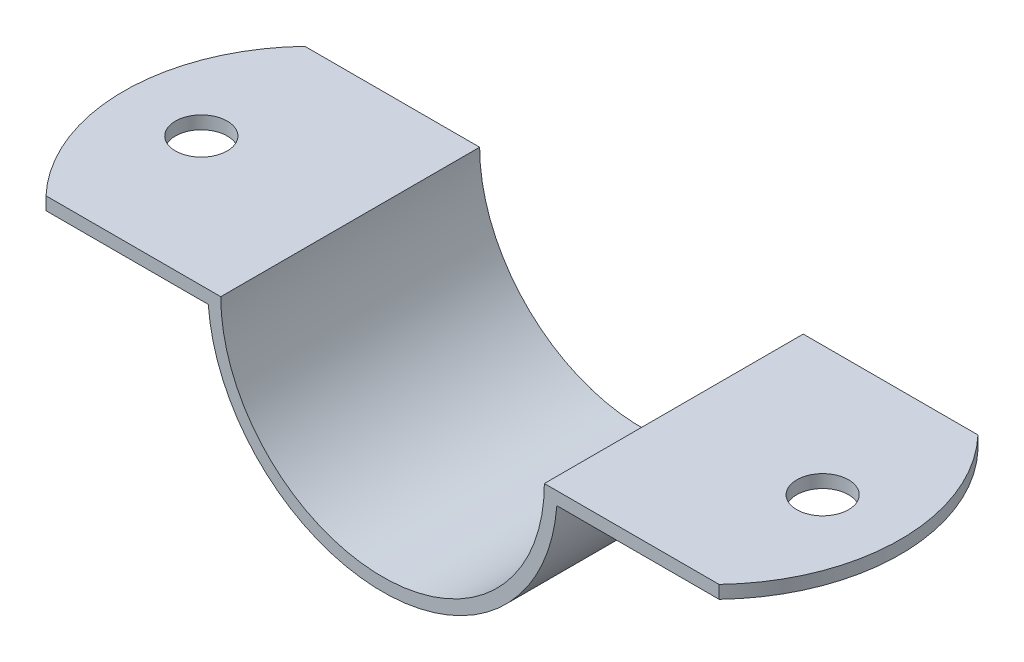
ISO-10303-21;
HEADER;
FILE_DESCRIPTION(('STEP AP214'),'2;1');
FILE_NAME('part.step','',(''),(''),'','','');
FILE_SCHEMA(('AUTOMOTIVE_DESIGN { 1 0 10303 214 1 1 1 1 }'));
ENDSEC;
DATA;
#1=APPLICATION_CONTEXT('core data for automotive mechanical design processes');
#2=APPLICATION_PROTOCOL_DEFINITION('international standard','automotive_design',2000,#1);
#3=PRODUCT_CONTEXT('',#1,'mechanical');
#4=PRODUCT('Part','Part','',(#3));
#5=PRODUCT_RELATED_PRODUCT_CATEGORY('part','',(#4));
#6=PRODUCT_DEFINITION_FORMATION('','',#4);
#7=PRODUCT_DEFINITION_CONTEXT('part definition',#1,'design');
#8=PRODUCT_DEFINITION('design','',#6,#7);
#9=PRODUCT_DEFINITION_SHAPE('','',#8);
#10=(LENGTH_UNIT() NAMED_UNIT(*) SI_UNIT(.MILLI.,.METRE.));
#11=(NAMED_UNIT(*) PLANE_ANGLE_UNIT() SI_UNIT($,.RADIAN.));
#12=(NAMED_UNIT(*) SI_UNIT($,.STERADIAN.) SOLID_ANGLE_UNIT());
#13=UNCERTAINTY_MEASURE_WITH_UNIT(LENGTH_MEASURE(1.E-05),#10,'distance_accuracy_value','');
#14=(GEOMETRIC_REPRESENTATION_CONTEXT(3) GLOBAL_UNCERTAINTY_ASSIGNED_CONTEXT((#13)) GLOBAL_UNIT_ASSIGNED_CONTEXT((#10,
#11,#12)) REPRESENTATION_CONTEXT('',''));
#15=CARTESIAN_POINT('',(0.,0.,0.));
#16=DIRECTION('',(0.,0.,1.));
#17=DIRECTION('',(1.,0.,0.));
#18=AXIS2_PLACEMENT_3D('',#15,#16,#17);
#19=CARTESIAN_POINT('',(-12.5,0.,20.));
#20=DIRECTION('',(0.,-1.,0.));
#21=DIRECTION('',(1.,0.,0.));
#22=AXIS2_PLACEMENT_3D('',#19,#20,#21);
#23=PLANE('',#22);
#24=CARTESIAN_POINT('',(-15.5,0.,10.));
#25=DIRECTION('',(0.,1.,0.));
#26=DIRECTION('',(0.,0.,1.));
#27=AXIS2_PLACEMENT_3D('',#24,#25,#26);
#28=CIRCLE('',#27,14.5);
#29=CARTESIAN_POINT('',(-26.,0.,20.));
#30=VERTEX_POINT('',#29);
#31=CARTESIAN_POINT('',(-26.,0.,0.));
#32=VERTEX_POINT('',#31);
#33=EDGE_CURVE('E73',#30,#32,#28,.F.);
#34=ORIENTED_EDGE('',*,*,#33,.F.);
#35=DIRECTION('',(-1.,0.,0.));
#36=VECTOR('',#35,1.);
#37=CARTESIAN_POINT('',(-12.5,0.,20.));
#38=LINE('',#37,#36);
#39=CARTESIAN_POINT('',(-12.5,0.,20.));
#40=VERTEX_POINT('',#39);
#41=EDGE_CURVE('E125',#40,#30,#38,.T.);
#42=ORIENTED_EDGE('',*,*,#41,.F.);
#43=DIRECTION('',(0.,0.,-1.));
#44=VECTOR('',#43,1.);
#45=CARTESIAN_POINT('',(-12.5,0.,20.));
#46=LINE('',#45,#44);
#47=CARTESIAN_POINT('',(-12.5,0.,0.));
#48=VERTEX_POINT('',#47);
#49=EDGE_CURVE('E175',#40,#48,#46,.T.);
#50=ORIENTED_EDGE('',*,*,#49,.T.);
#51=DIRECTION('',(-1.,0.,0.));
#52=VECTOR('',#51,1.);
#53=CARTESIAN_POINT('',(-12.5,0.,0.));
#54=LINE('',#53,#52);
#55=EDGE_CURVE('E127',#48,#32,#54,.T.);
#56=ORIENTED_EDGE('',*,*,#55,.T.);
#57=EDGE_LOOP('',(#34,#42,#50,#56));
#58=FACE_BOUND('',#57,.T.);
#59=CARTESIAN_POINT('',(-24.,0.,10.));
#60=DIRECTION('',(0.,-1.,0.));
#61=DIRECTION('',(1.,0.,0.));
#62=AXIS2_PLACEMENT_3D('',#59,#60,#61);
#63=CIRCLE('',#62,2.00000000000001);
#64=CARTESIAN_POINT('',(-22.,0.,10.));
#65=VERTEX_POINT('',#64);
#66=EDGE_CURVE('E129',#65,#65,#63,.T.);
#67=ORIENTED_EDGE('',*,*,#66,.T.);
#68=EDGE_LOOP('',(#67));
#69=FACE_BOUND('',#68,.T.);
#70=ADVANCED_FACE('F58',(#58,#69),#23,.F.);
#71=CARTESIAN_POINT('',(-30.,-1.,20.));
#72=DIRECTION('',(0.,1.,0.));
#73=DIRECTION('',(-1.,0.,0.));
#74=AXIS2_PLACEMENT_3D('',#71,#72,#73);
#75=PLANE('',#74);
#76=DIRECTION('',(1.,0.,0.));
#77=VECTOR('',#76,1.);
#78=CARTESIAN_POINT('',(-30.,-1.,20.));
#79=LINE('',#78,#77);
#80=CARTESIAN_POINT('',(-26.,-1.,20.));
#81=VERTEX_POINT('',#80);
#82=CARTESIAN_POINT('',(-13.4629120178363,-0.999999999999997,20.));
#83=VERTEX_POINT('',#82);
#84=EDGE_CURVE('E139',#81,#83,#79,.T.);
#85=ORIENTED_EDGE('',*,*,#84,.F.);
#86=CARTESIAN_POINT('',(-15.5,-1.,10.));
#87=DIRECTION('',(0.,1.,0.));
#88=DIRECTION('',(-1.,0.,0.));
#89=AXIS2_PLACEMENT_3D('',#86,#87,#88);
#90=CIRCLE('',#89,14.5);
#91=CARTESIAN_POINT('',(-26.,-1.,0.));
#92=VERTEX_POINT('',#91);
#93=EDGE_CURVE('E128',#81,#92,#90,.F.);
#94=ORIENTED_EDGE('',*,*,#93,.T.);
#95=DIRECTION('',(1.,0.,0.));
#96=VECTOR('',#95,1.);
#97=CARTESIAN_POINT('',(-30.,-1.,0.));
#98=LINE('',#97,#96);
#99=CARTESIAN_POINT('',(-13.4629120178363,-0.999999999999997,0.));
#100=VERTEX_POINT('',#99);
#101=EDGE_CURVE('E159',#92,#100,#98,.T.);
#102=ORIENTED_EDGE('',*,*,#101,.T.);
#103=DIRECTION('',(0.,0.,-1.));
#104=VECTOR('',#103,1.);
#105=CARTESIAN_POINT('',(-13.4629120178363,-0.999999999999997,20.));
#106=LINE('',#105,#104);
#107=EDGE_CURVE('E172',#83,#100,#106,.T.);
#108=ORIENTED_EDGE('',*,*,#107,.F.);
#109=EDGE_LOOP('',(#85,#94,#102,#108));
#110=FACE_BOUND('',#109,.T.);
#111=CARTESIAN_POINT('',(-24.,-1.,10.));
#112=DIRECTION('',(0.,1.,0.));
#113=DIRECTION('',(-1.,0.,0.));
#114=AXIS2_PLACEMENT_3D('',#111,#112,#113);
#115=CIRCLE('',#114,2.00000000000001);
#116=CARTESIAN_POINT('',(-26.,-1.,10.));
#117=VERTEX_POINT('',#116);
#118=EDGE_CURVE('E211',#117,#117,#115,.T.);
#119=ORIENTED_EDGE('',*,*,#118,.T.);
#120=EDGE_LOOP('',(#119));
#121=FACE_BOUND('',#120,.T.);
#122=ADVANCED_FACE('F183',(#110,#121),#75,.F.);
#123=CARTESIAN_POINT('',(30.,-1.,20.));
#124=DIRECTION('',(0.,1.,0.));
#125=DIRECTION('',(0.,0.,1.));
#126=AXIS2_PLACEMENT_3D('',#123,#124,#125);
#127=PLANE('',#126);
#128=CARTESIAN_POINT('',(24.,-1.,10.));
#129=DIRECTION('',(0.,-1.,0.));
#130=DIRECTION('',(0.,0.,-1.));
#131=AXIS2_PLACEMENT_3D('',#128,#129,#130);
#132=CIRCLE('',#131,2.);
#133=CARTESIAN_POINT('',(24.,-1.,8.));
#134=VERTEX_POINT('',#133);
#135=EDGE_CURVE('E215',#134,#134,#132,.T.);
#136=ORIENTED_EDGE('',*,*,#135,.F.);
#137=EDGE_LOOP('',(#136));
#138=FACE_BOUND('',#137,.T.);
#139=DIRECTION('',(1.,0.,0.));
#140=VECTOR('',#139,1.);
#141=CARTESIAN_POINT('',(30.,-1.,0.));
#142=LINE('',#141,#140);
#143=CARTESIAN_POINT('',(13.4629120178363,-1.,0.));
#144=VERTEX_POINT('',#143);
#145=CARTESIAN_POINT('',(26.,-1.,0.));
#146=VERTEX_POINT('',#145);
#147=EDGE_CURVE('E163',#144,#146,#142,.T.);
#148=ORIENTED_EDGE('',*,*,#147,.T.);
#149=CARTESIAN_POINT('',(15.5,-1.,10.));
#150=DIRECTION('',(0.,1.,0.));
#151=DIRECTION('',(0.,0.,1.));
#152=AXIS2_PLACEMENT_3D('',#149,#150,#151);
#153=CIRCLE('',#152,14.5);
#154=CARTESIAN_POINT('',(26.,-1.,20.));
#155=VERTEX_POINT('',#154);
#156=EDGE_CURVE('E157',#146,#155,#153,.F.);
#157=ORIENTED_EDGE('',*,*,#156,.T.);
#158=DIRECTION('',(1.,0.,0.));
#159=VECTOR('',#158,1.);
#160=CARTESIAN_POINT('',(30.,-1.,20.));
#161=LINE('',#160,#159);
#162=CARTESIAN_POINT('',(13.4629120178363,-1.,20.));
#163=VERTEX_POINT('',#162);
#164=EDGE_CURVE('E148',#163,#155,#161,.T.);
#165=ORIENTED_EDGE('',*,*,#164,.F.);
#166=DIRECTION('',(0.,0.,-1.));
#167=VECTOR('',#166,1.);
#168=CARTESIAN_POINT('',(13.4629120178363,-1.,20.));
#169=LINE('',#168,#167);
#170=EDGE_CURVE('E169',#163,#144,#169,.T.);
#171=ORIENTED_EDGE('',*,*,#170,.T.);
#172=EDGE_LOOP('',(#148,#157,#165,#171));
#173=FACE_BOUND('',#172,.T.);
#174=ADVANCED_FACE('F197',(#138,#173),#127,.F.);
#175=CARTESIAN_POINT('',(12.5,0.,20.));
#176=DIRECTION('',(0.,-1.,0.));
#177=DIRECTION('',(1.,0.,0.));
#178=AXIS2_PLACEMENT_3D('',#175,#176,#177);
#179=PLANE('',#178);
#180=CARTESIAN_POINT('',(24.,0.,10.));
#181=DIRECTION('',(0.,-1.,0.));
#182=DIRECTION('',(0.,0.,-1.));
#183=AXIS2_PLACEMENT_3D('',#180,#181,#182);
#184=CIRCLE('',#183,2.);
#185=CARTESIAN_POINT('',(24.,0.,8.));
#186=VERTEX_POINT('',#185);
#187=EDGE_CURVE('E214',#186,#186,#184,.T.);
#188=ORIENTED_EDGE('',*,*,#187,.T.);
#189=EDGE_LOOP('',(#188));
#190=FACE_BOUND('',#189,.T.);
#191=CARTESIAN_POINT('',(15.5,0.,10.));
#192=DIRECTION('',(0.,1.,0.));
#193=DIRECTION('',(0.,0.,1.));
#194=AXIS2_PLACEMENT_3D('',#191,#192,#193);
#195=CIRCLE('',#194,14.5);
#196=CARTESIAN_POINT('',(26.,0.,0.));
#197=VERTEX_POINT('',#196);
#198=CARTESIAN_POINT('',(26.,0.,20.));
#199=VERTEX_POINT('',#198);
#200=EDGE_CURVE('E81',#197,#199,#195,.F.);
#201=ORIENTED_EDGE('',*,*,#200,.F.);
#202=DIRECTION('',(-1.,0.,0.));
#203=VECTOR('',#202,1.);
#204=CARTESIAN_POINT('',(12.5,0.,0.));
#205=LINE('',#204,#203);
#206=CARTESIAN_POINT('',(12.5,0.,0.));
#207=VERTEX_POINT('',#206);
#208=EDGE_CURVE('E143',#197,#207,#205,.T.);
#209=ORIENTED_EDGE('',*,*,#208,.T.);
#210=DIRECTION('',(0.,0.,-1.));
#211=VECTOR('',#210,1.);
#212=CARTESIAN_POINT('',(12.5,0.,20.));
#213=LINE('',#212,#211);
#214=CARTESIAN_POINT('',(12.5,0.,20.));
#215=VERTEX_POINT('',#214);
#216=EDGE_CURVE('E153',#215,#207,#213,.T.);
#217=ORIENTED_EDGE('',*,*,#216,.F.);
#218=DIRECTION('',(-1.,0.,0.));
#219=VECTOR('',#218,1.);
#220=CARTESIAN_POINT('',(12.5,0.,20.));
#221=LINE('',#220,#219);
#222=EDGE_CURVE('E151',#199,#215,#221,.T.);
#223=ORIENTED_EDGE('',*,*,#222,.F.);
#224=EDGE_LOOP('',(#201,#209,#217,#223));
#225=FACE_BOUND('',#224,.T.);
#226=ADVANCED_FACE('F202',(#190,#225),#179,.F.);
#227=CARTESIAN_POINT('',(0.,0.,20.));
#228=DIRECTION('',(0.,0.,-1.));
#229=DIRECTION('',(-1.,0.,0.));
#230=AXIS2_PLACEMENT_3D('',#227,#228,#229);
#231=CYLINDRICAL_SURFACE('',#230,12.5);
#232=CARTESIAN_POINT('',(0.,0.,0.));
#233=DIRECTION('',(0.,0.,-1.));
#234=DIRECTION('',(-1.,0.,0.));
#235=AXIS2_PLACEMENT_3D('',#232,#233,#234);
#236=CIRCLE('',#235,12.5);
#237=EDGE_CURVE('E154',#207,#48,#236,.T.);
#238=ORIENTED_EDGE('',*,*,#237,.T.);
#239=ORIENTED_EDGE('',*,*,#49,.F.);
#240=CARTESIAN_POINT('',(0.,0.,20.));
#241=DIRECTION('',(0.,0.,-1.));
#242=DIRECTION('',(-1.,0.,0.));
#243=AXIS2_PLACEMENT_3D('',#240,#241,#242);
#244=CIRCLE('',#243,12.5);
#245=EDGE_CURVE('E137',#215,#40,#244,.T.);
#246=ORIENTED_EDGE('',*,*,#245,.F.);
#247=ORIENTED_EDGE('',*,*,#216,.T.);
#248=EDGE_LOOP('',(#238,#239,#246,#247));
#249=FACE_BOUND('',#248,.T.);
#250=ADVANCED_FACE('F60',(#249),#231,.F.);
#251=CARTESIAN_POINT('',(0.,0.,20.));
#252=DIRECTION('',(0.,0.,-1.));
#253=DIRECTION('',(-1.,0.,0.));
#254=AXIS2_PLACEMENT_3D('',#251,#252,#253);
#255=CYLINDRICAL_SURFACE('',#254,13.5);
#256=CARTESIAN_POINT('',(0.,0.,0.));
#257=DIRECTION('',(0.,0.,1.));
#258=DIRECTION('',(1.,0.,0.));
#259=AXIS2_PLACEMENT_3D('',#256,#257,#258);
#260=CIRCLE('',#259,13.5);
#261=EDGE_CURVE('E161',#100,#144,#260,.T.);
#262=ORIENTED_EDGE('',*,*,#261,.T.);
#263=ORIENTED_EDGE('',*,*,#170,.F.);
#264=CARTESIAN_POINT('',(0.,0.,20.));
#265=DIRECTION('',(0.,0.,1.));
#266=DIRECTION('',(1.,0.,0.));
#267=AXIS2_PLACEMENT_3D('',#264,#265,#266);
#268=CIRCLE('',#267,13.5);
#269=EDGE_CURVE('E141',#83,#163,#268,.T.);
#270=ORIENTED_EDGE('',*,*,#269,.F.);
#271=ORIENTED_EDGE('',*,*,#107,.T.);
#272=EDGE_LOOP('',(#262,#263,#270,#271));
#273=FACE_BOUND('',#272,.T.);
#274=ADVANCED_FACE('F193',(#273),#255,.T.);
#275=CARTESIAN_POINT('',(0.,0.,20.));
#276=DIRECTION('',(0.,0.,-1.));
#277=DIRECTION('',(-1.,0.,0.));
#278=AXIS2_PLACEMENT_3D('',#275,#276,#277);
#279=PLANE('',#278);
#280=ORIENTED_EDGE('',*,*,#41,.T.);
#281=DIRECTION('',(0.,1.,0.));
#282=VECTOR('',#281,1.);
#283=CARTESIAN_POINT('',(-26.,-20.,20.));
#284=LINE('',#283,#282);
#285=EDGE_CURVE('E12',#30,#81,#284,.F.);
#286=ORIENTED_EDGE('',*,*,#285,.T.);
#287=ORIENTED_EDGE('',*,*,#84,.T.);
#288=ORIENTED_EDGE('',*,*,#269,.T.);
#289=ORIENTED_EDGE('',*,*,#164,.T.);
#290=DIRECTION('',(0.,1.,0.));
#291=VECTOR('',#290,1.);
#292=CARTESIAN_POINT('',(26.,-20.,20.));
#293=LINE('',#292,#291);
#294=EDGE_CURVE('E177',#155,#199,#293,.T.);
#295=ORIENTED_EDGE('',*,*,#294,.T.);
#296=ORIENTED_EDGE('',*,*,#222,.T.);
#297=ORIENTED_EDGE('',*,*,#245,.T.);
#298=EDGE_LOOP('',(#280,#286,#287,#288,#289,#295,#296,#297));
#299=FACE_BOUND('',#298,.T.);
#300=ADVANCED_FACE('F135',(#299),#279,.F.);
#301=CARTESIAN_POINT('',(0.,0.,0.));
#302=DIRECTION('',(0.,0.,-1.));
#303=DIRECTION('',(-1.,0.,0.));
#304=AXIS2_PLACEMENT_3D('',#301,#302,#303);
#305=PLANE('',#304);
#306=DIRECTION('',(0.,1.,0.));
#307=VECTOR('',#306,1.);
#308=CARTESIAN_POINT('',(-26.,-20.,0.));
#309=LINE('',#308,#307);
#310=EDGE_CURVE('E66',#32,#92,#309,.F.);
#311=ORIENTED_EDGE('',*,*,#310,.F.);
#312=ORIENTED_EDGE('',*,*,#55,.F.);
#313=ORIENTED_EDGE('',*,*,#237,.F.);
#314=ORIENTED_EDGE('',*,*,#208,.F.);
#315=DIRECTION('',(0.,1.,0.));
#316=VECTOR('',#315,1.);
#317=CARTESIAN_POINT('',(26.,-20.,0.));
#318=LINE('',#317,#316);
#319=EDGE_CURVE('E179',#146,#197,#318,.T.);
#320=ORIENTED_EDGE('',*,*,#319,.F.);
#321=ORIENTED_EDGE('',*,*,#147,.F.);
#322=ORIENTED_EDGE('',*,*,#261,.F.);
#323=ORIENTED_EDGE('',*,*,#101,.F.);
#324=EDGE_LOOP('',(#311,#312,#313,#314,#320,#321,#322,#323));
#325=FACE_BOUND('',#324,.T.);
#326=ADVANCED_FACE('F188',(#325),#305,.T.);
#327=CARTESIAN_POINT('',(15.5,-20.,10.));
#328=DIRECTION('',(0.,1.,0.));
#329=DIRECTION('',(0.,0.,1.));
#330=AXIS2_PLACEMENT_3D('',#327,#328,#329);
#331=CYLINDRICAL_SURFACE('',#330,14.5);
#332=ORIENTED_EDGE('',*,*,#156,.F.);
#333=ORIENTED_EDGE('',*,*,#319,.T.);
#334=ORIENTED_EDGE('',*,*,#200,.T.);
#335=ORIENTED_EDGE('',*,*,#294,.F.);
#336=EDGE_LOOP('',(#332,#333,#334,#335));
#337=FACE_BOUND('',#336,.T.);
#338=ADVANCED_FACE('F206',(#337),#331,.T.);
#339=CARTESIAN_POINT('',(-15.5,-20.,10.));
#340=DIRECTION('',(0.,1.,0.));
#341=DIRECTION('',(0.,0.,1.));
#342=AXIS2_PLACEMENT_3D('',#339,#340,#341);
#343=CYLINDRICAL_SURFACE('',#342,14.5);
#344=ORIENTED_EDGE('',*,*,#93,.F.);
#345=ORIENTED_EDGE('',*,*,#285,.F.);
#346=ORIENTED_EDGE('',*,*,#33,.T.);
#347=ORIENTED_EDGE('',*,*,#310,.T.);
#348=EDGE_LOOP('',(#344,#345,#346,#347));
#349=FACE_BOUND('',#348,.T.);
#350=ADVANCED_FACE('F131',(#349),#343,.T.);
#351=CARTESIAN_POINT('',(-24.,8.,10.));
#352=DIRECTION('',(0.,-1.,0.));
#353=DIRECTION('',(0.,0.,-1.));
#354=AXIS2_PLACEMENT_3D('',#351,#352,#353);
#355=CYLINDRICAL_SURFACE('',#354,2.00000000000001);
#356=ORIENTED_EDGE('',*,*,#66,.F.);
#357=EDGE_LOOP('',(#356));
#358=FACE_BOUND('',#357,.T.);
#359=ORIENTED_EDGE('',*,*,#118,.F.);
#360=EDGE_LOOP('',(#359));
#361=FACE_BOUND('',#360,.T.);
#362=ADVANCED_FACE('F225',(#358,#361),#355,.F.);
#363=CARTESIAN_POINT('',(24.,0.,10.));
#364=DIRECTION('',(0.,-1.,0.));
#365=DIRECTION('',(0.,0.,-1.));
#366=AXIS2_PLACEMENT_3D('',#363,#364,#365);
#367=CYLINDRICAL_SURFACE('',#366,2.);
#368=ORIENTED_EDGE('',*,*,#187,.F.);
#369=EDGE_LOOP('',(#368));
#370=FACE_BOUND('',#369,.T.);
#371=ORIENTED_EDGE('',*,*,#135,.T.);
#372=EDGE_LOOP('',(#371));
#373=FACE_BOUND('',#372,.T.);
#374=ADVANCED_FACE('F222',(#370,#373),#367,.F.);
#375=CLOSED_SHELL('',(#70,#122,#174,#226,#250,#274,#300,#326,#338,#350,#362,#374));
#376=MANIFOLD_SOLID_BREP('B2',#375);
#377=ADVANCED_BREP_SHAPE_REPRESENTATION('',(#18,#376),#14);
#378=SHAPE_DEFINITION_REPRESENTATION(#9,#377);
ENDSEC;
END-ISO-10303-21;
